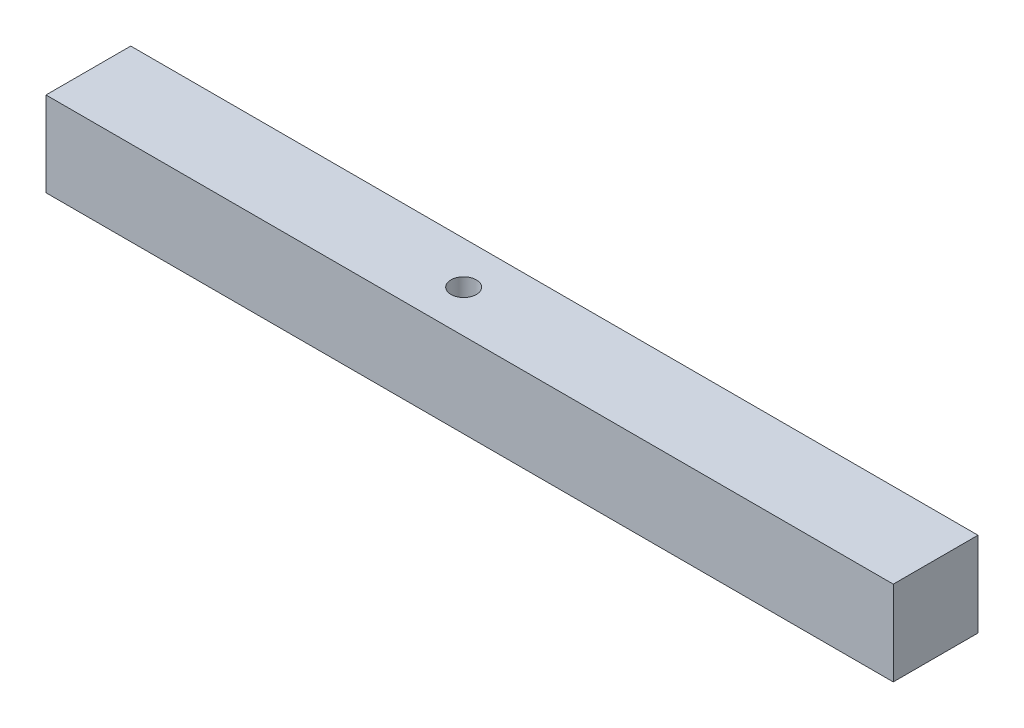
ISO-10303-21;
HEADER;
FILE_DESCRIPTION(('STEP AP214'),'2;1');
FILE_NAME('part.step','',(''),(''),'','','');
FILE_SCHEMA(('AUTOMOTIVE_DESIGN { 1 0 10303 214 1 1 1 1 }'));
ENDSEC;
DATA;
#1=APPLICATION_CONTEXT('core data for automotive mechanical design processes');
#2=APPLICATION_PROTOCOL_DEFINITION('international standard','automotive_design',2000,#1);
#3=PRODUCT_CONTEXT('',#1,'mechanical');
#4=PRODUCT('Part','Part','',(#3));
#5=PRODUCT_RELATED_PRODUCT_CATEGORY('part','',(#4));
#6=PRODUCT_DEFINITION_FORMATION('','',#4);
#7=PRODUCT_DEFINITION_CONTEXT('part definition',#1,'design');
#8=PRODUCT_DEFINITION('design','',#6,#7);
#9=PRODUCT_DEFINITION_SHAPE('','',#8);
#10=(LENGTH_UNIT() NAMED_UNIT(*) SI_UNIT(.MILLI.,.METRE.));
#11=(NAMED_UNIT(*) PLANE_ANGLE_UNIT() SI_UNIT($,.RADIAN.));
#12=(NAMED_UNIT(*) SI_UNIT($,.STERADIAN.) SOLID_ANGLE_UNIT());
#13=UNCERTAINTY_MEASURE_WITH_UNIT(LENGTH_MEASURE(1.E-05),#10,'distance_accuracy_value','');
#14=(GEOMETRIC_REPRESENTATION_CONTEXT(3) GLOBAL_UNCERTAINTY_ASSIGNED_CONTEXT((#13)) GLOBAL_UNIT_ASSIGNED_CONTEXT((#10,
#11,#12)) REPRESENTATION_CONTEXT('',''));
#15=CARTESIAN_POINT('',(0.,0.,0.));
#16=DIRECTION('',(0.,0.,1.));
#17=DIRECTION('',(1.,0.,0.));
#18=AXIS2_PLACEMENT_3D('',#15,#16,#17);
#19=CARTESIAN_POINT('',(200.,-10.,-10.));
#20=DIRECTION('',(0.,0.,1.));
#21=DIRECTION('',(1.,0.,0.));
#22=AXIS2_PLACEMENT_3D('',#19,#20,#21);
#23=PLANE('',#22);
#24=DIRECTION('',(0.,1.,0.));
#25=VECTOR('',#24,1.);
#26=CARTESIAN_POINT('',(0.,-10.,-10.));
#27=LINE('',#26,#25);
#28=CARTESIAN_POINT('',(0.,-10.,-10.));
#29=VERTEX_POINT('',#28);
#30=CARTESIAN_POINT('',(0.,10.,-10.));
#31=VERTEX_POINT('',#30);
#32=EDGE_CURVE('E95',#29,#31,#27,.T.);
#33=ORIENTED_EDGE('',*,*,#32,.T.);
#34=DIRECTION('',(-1.,0.,0.));
#35=VECTOR('',#34,1.);
#36=CARTESIAN_POINT('',(200.,10.,-10.));
#37=LINE('',#36,#35);
#38=CARTESIAN_POINT('',(200.,10.,-10.));
#39=VERTEX_POINT('',#38);
#40=EDGE_CURVE('E11',#39,#31,#37,.T.);
#41=ORIENTED_EDGE('',*,*,#40,.F.);
#42=DIRECTION('',(0.,1.,0.));
#43=VECTOR('',#42,1.);
#44=CARTESIAN_POINT('',(200.,-10.,-10.));
#45=LINE('',#44,#43);
#46=CARTESIAN_POINT('',(200.,-10.,-10.));
#47=VERTEX_POINT('',#46);
#48=EDGE_CURVE('E83',#47,#39,#45,.T.);
#49=ORIENTED_EDGE('',*,*,#48,.F.);
#50=DIRECTION('',(-1.,0.,0.));
#51=VECTOR('',#50,1.);
#52=CARTESIAN_POINT('',(200.,-10.,-10.));
#53=LINE('',#52,#51);
#54=EDGE_CURVE('E91',#47,#29,#53,.T.);
#55=ORIENTED_EDGE('',*,*,#54,.T.);
#56=EDGE_LOOP('',(#33,#41,#49,#55));
#57=FACE_BOUND('',#56,.T.);
#58=ADVANCED_FACE('F32',(#57),#23,.F.);
#59=CARTESIAN_POINT('',(200.,10.,10.));
#60=DIRECTION('',(0.,-1.,0.));
#61=DIRECTION('',(0.,0.,-1.));
#62=AXIS2_PLACEMENT_3D('',#59,#60,#61);
#63=PLANE('',#62);
#64=CARTESIAN_POINT('',(88.59,10.,0.));
#65=DIRECTION('',(0.,1.,0.));
#66=DIRECTION('',(0.,0.,1.));
#67=AXIS2_PLACEMENT_3D('',#64,#65,#66);
#68=CIRCLE('',#67,3.00000000000001);
#69=CARTESIAN_POINT('',(88.59,10.,3.00000000000001));
#70=VERTEX_POINT('',#69);
#71=EDGE_CURVE('E109',#70,#70,#68,.T.);
#72=ORIENTED_EDGE('',*,*,#71,.F.);
#73=EDGE_LOOP('',(#72));
#74=FACE_BOUND('',#73,.T.);
#75=DIRECTION('',(0.,0.,1.));
#76=VECTOR('',#75,1.);
#77=CARTESIAN_POINT('',(0.,10.,10.));
#78=LINE('',#77,#76);
#79=CARTESIAN_POINT('',(0.,10.,10.));
#80=VERTEX_POINT('',#79);
#81=EDGE_CURVE('E87',#31,#80,#78,.T.);
#82=ORIENTED_EDGE('',*,*,#81,.T.);
#83=DIRECTION('',(-1.,0.,0.));
#84=VECTOR('',#83,1.);
#85=CARTESIAN_POINT('',(200.,10.,10.));
#86=LINE('',#85,#84);
#87=CARTESIAN_POINT('',(200.,10.,10.));
#88=VERTEX_POINT('',#87);
#89=EDGE_CURVE('E40',#88,#80,#86,.T.);
#90=ORIENTED_EDGE('',*,*,#89,.F.);
#91=DIRECTION('',(0.,0.,1.));
#92=VECTOR('',#91,1.);
#93=CARTESIAN_POINT('',(200.,10.,10.));
#94=LINE('',#93,#92);
#95=EDGE_CURVE('E78',#39,#88,#94,.T.);
#96=ORIENTED_EDGE('',*,*,#95,.F.);
#97=ORIENTED_EDGE('',*,*,#40,.T.);
#98=EDGE_LOOP('',(#82,#90,#96,#97));
#99=FACE_BOUND('',#98,.T.);
#100=ADVANCED_FACE('F86',(#74,#99),#63,.F.);
#101=CARTESIAN_POINT('',(200.,-10.,10.));
#102=DIRECTION('',(0.,0.,-1.));
#103=DIRECTION('',(-1.,0.,0.));
#104=AXIS2_PLACEMENT_3D('',#101,#102,#103);
#105=PLANE('',#104);
#106=DIRECTION('',(0.,-1.,0.));
#107=VECTOR('',#106,1.);
#108=CARTESIAN_POINT('',(0.,-10.,10.));
#109=LINE('',#108,#107);
#110=CARTESIAN_POINT('',(0.,-10.,10.));
#111=VERTEX_POINT('',#110);
#112=EDGE_CURVE('E65',#80,#111,#109,.T.);
#113=ORIENTED_EDGE('',*,*,#112,.T.);
#114=DIRECTION('',(-1.,0.,0.));
#115=VECTOR('',#114,1.);
#116=CARTESIAN_POINT('',(200.,-10.,10.));
#117=LINE('',#116,#115);
#118=CARTESIAN_POINT('',(200.,-10.,10.));
#119=VERTEX_POINT('',#118);
#120=EDGE_CURVE('E88',#119,#111,#117,.T.);
#121=ORIENTED_EDGE('',*,*,#120,.F.);
#122=DIRECTION('',(0.,-1.,0.));
#123=VECTOR('',#122,1.);
#124=CARTESIAN_POINT('',(200.,-10.,10.));
#125=LINE('',#124,#123);
#126=EDGE_CURVE('E81',#88,#119,#125,.T.);
#127=ORIENTED_EDGE('',*,*,#126,.F.);
#128=ORIENTED_EDGE('',*,*,#89,.T.);
#129=EDGE_LOOP('',(#113,#121,#127,#128));
#130=FACE_BOUND('',#129,.T.);
#131=ADVANCED_FACE('F89',(#130),#105,.F.);
#132=CARTESIAN_POINT('',(200.,-10.,10.));
#133=DIRECTION('',(0.,1.,0.));
#134=DIRECTION('',(0.,0.,1.));
#135=AXIS2_PLACEMENT_3D('',#132,#133,#134);
#136=PLANE('',#135);
#137=CARTESIAN_POINT('',(88.59,-10.,0.));
#138=DIRECTION('',(0.,1.,0.));
#139=DIRECTION('',(0.,0.,1.));
#140=AXIS2_PLACEMENT_3D('',#137,#138,#139);
#141=CIRCLE('',#140,3.00000000000001);
#142=CARTESIAN_POINT('',(88.59,-10.,3.00000000000001));
#143=VERTEX_POINT('',#142);
#144=EDGE_CURVE('E98',#143,#143,#141,.T.);
#145=ORIENTED_EDGE('',*,*,#144,.T.);
#146=EDGE_LOOP('',(#145));
#147=FACE_BOUND('',#146,.T.);
#148=DIRECTION('',(0.,0.,-1.));
#149=VECTOR('',#148,1.);
#150=CARTESIAN_POINT('',(0.,-10.,10.));
#151=LINE('',#150,#149);
#152=EDGE_CURVE('E71',#111,#29,#151,.T.);
#153=ORIENTED_EDGE('',*,*,#152,.T.);
#154=ORIENTED_EDGE('',*,*,#54,.F.);
#155=DIRECTION('',(0.,0.,-1.));
#156=VECTOR('',#155,1.);
#157=CARTESIAN_POINT('',(200.,-10.,10.));
#158=LINE('',#157,#156);
#159=EDGE_CURVE('E48',#119,#47,#158,.T.);
#160=ORIENTED_EDGE('',*,*,#159,.F.);
#161=ORIENTED_EDGE('',*,*,#120,.T.);
#162=EDGE_LOOP('',(#153,#154,#160,#161));
#163=FACE_BOUND('',#162,.T.);
#164=ADVANCED_FACE('F103',(#147,#163),#136,.F.);
#165=CARTESIAN_POINT('',(200.,0.,0.));
#166=DIRECTION('',(-1.,0.,0.));
#167=DIRECTION('',(0.,0.,1.));
#168=AXIS2_PLACEMENT_3D('',#165,#166,#167);
#169=PLANE('',#168);
#170=ORIENTED_EDGE('',*,*,#48,.T.);
#171=ORIENTED_EDGE('',*,*,#95,.T.);
#172=ORIENTED_EDGE('',*,*,#126,.T.);
#173=ORIENTED_EDGE('',*,*,#159,.T.);
#174=EDGE_LOOP('',(#170,#171,#172,#173));
#175=FACE_BOUND('',#174,.T.);
#176=ADVANCED_FACE('F79',(#175),#169,.F.);
#177=CARTESIAN_POINT('',(0.,0.,0.));
#178=DIRECTION('',(-1.,0.,0.));
#179=DIRECTION('',(0.,0.,1.));
#180=AXIS2_PLACEMENT_3D('',#177,#178,#179);
#181=PLANE('',#180);
#182=ORIENTED_EDGE('',*,*,#32,.F.);
#183=ORIENTED_EDGE('',*,*,#152,.F.);
#184=ORIENTED_EDGE('',*,*,#112,.F.);
#185=ORIENTED_EDGE('',*,*,#81,.F.);
#186=EDGE_LOOP('',(#182,#183,#184,#185));
#187=FACE_BOUND('',#186,.T.);
#188=ADVANCED_FACE('F106',(#187),#181,.T.);
#189=CARTESIAN_POINT('',(88.59,-10.,0.));
#190=DIRECTION('',(0.,1.,0.));
#191=DIRECTION('',(0.,0.,1.));
#192=AXIS2_PLACEMENT_3D('',#189,#190,#191);
#193=CYLINDRICAL_SURFACE('',#192,3.00000000000001);
#194=ORIENTED_EDGE('',*,*,#144,.F.);
#195=EDGE_LOOP('',(#194));
#196=FACE_BOUND('',#195,.T.);
#197=ORIENTED_EDGE('',*,*,#71,.T.);
#198=EDGE_LOOP('',(#197));
#199=FACE_BOUND('',#198,.T.);
#200=ADVANCED_FACE('F116',(#196,#199),#193,.F.);
#201=CLOSED_SHELL('',(#58,#100,#131,#164,#176,#188,#200));
#202=MANIFOLD_SOLID_BREP('B2',#201);
#203=ADVANCED_BREP_SHAPE_REPRESENTATION('',(#18,#202),#14);
#204=SHAPE_DEFINITION_REPRESENTATION(#9,#203);
ENDSEC;
END-ISO-10303-21;
